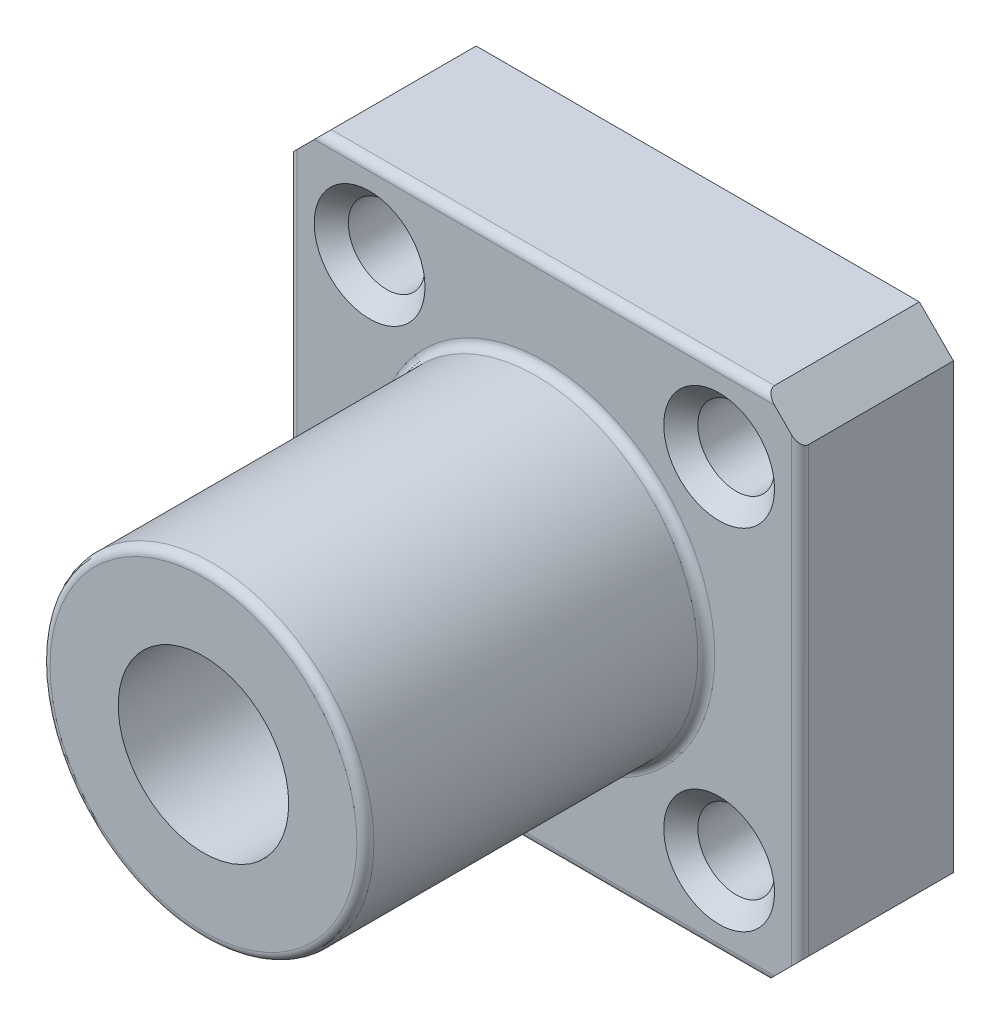
ISO-10303-21;
HEADER;
FILE_DESCRIPTION(('STEP AP214'),'2;1');
FILE_NAME('part.step','',(''),(''),'','','');
FILE_SCHEMA(('AUTOMOTIVE_DESIGN { 1 0 10303 214 1 1 1 1 }'));
ENDSEC;
DATA;
#1=APPLICATION_CONTEXT('core data for automotive mechanical design processes');
#2=APPLICATION_PROTOCOL_DEFINITION('international standard','automotive_design',2000,#1);
#3=PRODUCT_CONTEXT('',#1,'mechanical');
#4=PRODUCT('Part','Part','',(#3));
#5=PRODUCT_RELATED_PRODUCT_CATEGORY('part','',(#4));
#6=PRODUCT_DEFINITION_FORMATION('','',#4);
#7=PRODUCT_DEFINITION_CONTEXT('part definition',#1,'design');
#8=PRODUCT_DEFINITION('design','',#6,#7);
#9=PRODUCT_DEFINITION_SHAPE('','',#8);
#10=(LENGTH_UNIT() NAMED_UNIT(*) SI_UNIT(.MILLI.,.METRE.));
#11=(NAMED_UNIT(*) PLANE_ANGLE_UNIT() SI_UNIT($,.RADIAN.));
#12=(NAMED_UNIT(*) SI_UNIT($,.STERADIAN.) SOLID_ANGLE_UNIT());
#13=UNCERTAINTY_MEASURE_WITH_UNIT(LENGTH_MEASURE(1.E-05),#10,'distance_accuracy_value','');
#14=(GEOMETRIC_REPRESENTATION_CONTEXT(3) GLOBAL_UNCERTAINTY_ASSIGNED_CONTEXT((#13)) GLOBAL_UNIT_ASSIGNED_CONTEXT((#10,
#11,#12)) REPRESENTATION_CONTEXT('',''));
#15=CARTESIAN_POINT('',(0.,0.,0.));
#16=DIRECTION('',(0.,0.,1.));
#17=DIRECTION('',(1.,0.,0.));
#18=AXIS2_PLACEMENT_3D('',#15,#16,#17);
#19=CARTESIAN_POINT('',(0.,0.,9.));
#20=DIRECTION('',(0.,0.,1.));
#21=DIRECTION('',(1.,0.,0.));
#22=AXIS2_PLACEMENT_3D('',#19,#20,#21);
#23=PLANE('',#22);
#24=CARTESIAN_POINT('',(0.,0.,9.));
#25=DIRECTION('',(0.,0.,1.));
#26=DIRECTION('',(1.,0.,0.));
#27=AXIS2_PLACEMENT_3D('',#24,#25,#26);
#28=CIRCLE('',#27,10.);
#29=CARTESIAN_POINT('',(10.,0.,9.));
#30=VERTEX_POINT('',#29);
#31=EDGE_CURVE('E205',#30,#30,#28,.F.);
#32=ORIENTED_EDGE('',*,*,#31,.T.);
#33=EDGE_LOOP('',(#32));
#34=FACE_BOUND('',#33,.T.);
#35=DIRECTION('',(1.,0.,0.));
#36=VECTOR('',#35,1.);
#37=CARTESIAN_POINT('',(15.,-14.5,9.));
#38=LINE('',#37,#36);
#39=CARTESIAN_POINT('',(-13.5,-14.5,9.));
#40=VERTEX_POINT('',#39);
#41=CARTESIAN_POINT('',(13.5,-14.5,9.));
#42=VERTEX_POINT('',#41);
#43=EDGE_CURVE('E195',#40,#42,#38,.T.);
#44=ORIENTED_EDGE('',*,*,#43,.T.);
#45=DIRECTION('',(-0.707106781186548,-0.707106781186547,0.));
#46=VECTOR('',#45,1.);
#47=CARTESIAN_POINT('',(14.,-14.,9.));
#48=LINE('',#47,#46);
#49=CARTESIAN_POINT('',(14.5,-13.5,9.));
#50=VERTEX_POINT('',#49);
#51=EDGE_CURVE('E151',#42,#50,#48,.F.);
#52=ORIENTED_EDGE('',*,*,#51,.T.);
#53=DIRECTION('',(0.,1.,0.));
#54=VECTOR('',#53,1.);
#55=CARTESIAN_POINT('',(14.5,15.,9.));
#56=LINE('',#55,#54);
#57=CARTESIAN_POINT('',(14.5,13.5,9.));
#58=VERTEX_POINT('',#57);
#59=EDGE_CURVE('E206',#50,#58,#56,.T.);
#60=ORIENTED_EDGE('',*,*,#59,.T.);
#61=DIRECTION('',(0.707106781186546,-0.707106781186549,0.));
#62=VECTOR('',#61,1.);
#63=CARTESIAN_POINT('',(14.,14.,9.));
#64=LINE('',#63,#62);
#65=CARTESIAN_POINT('',(13.5,14.5,9.));
#66=VERTEX_POINT('',#65);
#67=EDGE_CURVE('E150',#58,#66,#64,.F.);
#68=ORIENTED_EDGE('',*,*,#67,.T.);
#69=DIRECTION('',(-1.,0.,0.));
#70=VECTOR('',#69,1.);
#71=CARTESIAN_POINT('',(-15.,14.5,9.));
#72=LINE('',#71,#70);
#73=CARTESIAN_POINT('',(-13.5,14.5,9.));
#74=VERTEX_POINT('',#73);
#75=EDGE_CURVE('E173',#66,#74,#72,.T.);
#76=ORIENTED_EDGE('',*,*,#75,.T.);
#77=DIRECTION('',(0.707106781186549,0.707106781186546,0.));
#78=VECTOR('',#77,1.);
#79=CARTESIAN_POINT('',(-14.,14.,9.));
#80=LINE('',#79,#78);
#81=CARTESIAN_POINT('',(-14.5,13.5,9.));
#82=VERTEX_POINT('',#81);
#83=EDGE_CURVE('E180',#74,#82,#80,.F.);
#84=ORIENTED_EDGE('',*,*,#83,.T.);
#85=DIRECTION('',(0.,-1.,0.));
#86=VECTOR('',#85,1.);
#87=CARTESIAN_POINT('',(-14.5,-15.,9.));
#88=LINE('',#87,#86);
#89=CARTESIAN_POINT('',(-14.5,-13.5,9.));
#90=VERTEX_POINT('',#89);
#91=EDGE_CURVE('E182',#82,#90,#88,.T.);
#92=ORIENTED_EDGE('',*,*,#91,.T.);
#93=DIRECTION('',(-0.707106781186546,0.707106781186549,0.));
#94=VECTOR('',#93,1.);
#95=CARTESIAN_POINT('',(-14.,-14.,9.));
#96=LINE('',#95,#94);
#97=EDGE_CURVE('E155',#90,#40,#96,.F.);
#98=ORIENTED_EDGE('',*,*,#97,.T.);
#99=EDGE_LOOP('',(#44,#52,#60,#68,#76,#84,#92,#98));
#100=FACE_BOUND('',#99,.T.);
#101=CARTESIAN_POINT('',(-10.2530483272048,10.253048327205,9.));
#102=DIRECTION('',(0.,0.,1.));
#103=DIRECTION('',(1.,0.,0.));
#104=AXIS2_PLACEMENT_3D('',#101,#102,#103);
#105=CIRCLE('',#104,3.24999999999999);
#106=CARTESIAN_POINT('',(-7.00304832720484,10.253048327205,9.));
#107=VERTEX_POINT('',#106);
#108=EDGE_CURVE('E241',#107,#107,#105,.F.);
#109=ORIENTED_EDGE('',*,*,#108,.T.);
#110=EDGE_LOOP('',(#109));
#111=FACE_BOUND('',#110,.T.);
#112=CARTESIAN_POINT('',(-10.2530483272049,-10.2530483272049,9.));
#113=DIRECTION('',(0.,0.,1.));
#114=DIRECTION('',(1.,0.,0.));
#115=AXIS2_PLACEMENT_3D('',#112,#113,#114);
#116=CIRCLE('',#115,3.25);
#117=CARTESIAN_POINT('',(-7.00304832720494,-10.2530483272049,9.));
#118=VERTEX_POINT('',#117);
#119=EDGE_CURVE('E247',#118,#118,#116,.F.);
#120=ORIENTED_EDGE('',*,*,#119,.T.);
#121=EDGE_LOOP('',(#120));
#122=FACE_BOUND('',#121,.T.);
#123=CARTESIAN_POINT('',(10.2530483272049,-10.253048327205,9.));
#124=DIRECTION('',(0.,0.,1.));
#125=DIRECTION('',(1.,0.,0.));
#126=AXIS2_PLACEMENT_3D('',#123,#124,#125);
#127=CIRCLE('',#126,3.24999999999999);
#128=CARTESIAN_POINT('',(13.5030483272049,-10.253048327205,9.));
#129=VERTEX_POINT('',#128);
#130=EDGE_CURVE('E253',#129,#129,#127,.F.);
#131=ORIENTED_EDGE('',*,*,#130,.T.);
#132=EDGE_LOOP('',(#131));
#133=FACE_BOUND('',#132,.T.);
#134=CARTESIAN_POINT('',(10.2530483272049,10.2530483272049,9.));
#135=DIRECTION('',(0.,0.,1.));
#136=DIRECTION('',(1.,0.,0.));
#137=AXIS2_PLACEMENT_3D('',#134,#135,#136);
#138=CIRCLE('',#137,3.25);
#139=CARTESIAN_POINT('',(13.5030483272049,10.2530483272049,9.));
#140=VERTEX_POINT('',#139);
#141=EDGE_CURVE('E259',#140,#140,#138,.F.);
#142=ORIENTED_EDGE('',*,*,#141,.T.);
#143=EDGE_LOOP('',(#142));
#144=FACE_BOUND('',#143,.T.);
#145=ADVANCED_FACE('F35',(#34,#100,#111,#122,#133,#144),#23,.T.);
#146=CARTESIAN_POINT('',(15.,15.,9.));
#147=DIRECTION('',(-1.,0.,0.));
#148=DIRECTION('',(0.,-1.,0.));
#149=AXIS2_PLACEMENT_3D('',#146,#147,#148);
#150=PLANE('',#149);
#151=DIRECTION('',(0.,1.,0.));
#152=VECTOR('',#151,1.);
#153=CARTESIAN_POINT('',(15.,-15.,8.5));
#154=LINE('',#153,#152);
#155=CARTESIAN_POINT('',(15.,13.,8.5));
#156=VERTEX_POINT('',#155);
#157=CARTESIAN_POINT('',(15.,-13.,8.5));
#158=VERTEX_POINT('',#157);
#159=EDGE_CURVE('E129',#156,#158,#154,.F.);
#160=ORIENTED_EDGE('',*,*,#159,.T.);
#161=DIRECTION('',(0.,0.,-1.));
#162=VECTOR('',#161,1.);
#163=CARTESIAN_POINT('',(15.,-13.,9.));
#164=LINE('',#163,#162);
#165=CARTESIAN_POINT('',(15.,-13.,0.));
#166=VERTEX_POINT('',#165);
#167=EDGE_CURVE('E135',#158,#166,#164,.T.);
#168=ORIENTED_EDGE('',*,*,#167,.T.);
#169=DIRECTION('',(0.,1.,0.));
#170=VECTOR('',#169,1.);
#171=CARTESIAN_POINT('',(15.,15.,0.));
#172=LINE('',#171,#170);
#173=CARTESIAN_POINT('',(15.,13.,0.));
#174=VERTEX_POINT('',#173);
#175=EDGE_CURVE('E132',#166,#174,#172,.T.);
#176=ORIENTED_EDGE('',*,*,#175,.T.);
#177=DIRECTION('',(0.,0.,1.));
#178=VECTOR('',#177,1.);
#179=CARTESIAN_POINT('',(15.,13.,9.));
#180=LINE('',#179,#178);
#181=EDGE_CURVE('E125',#174,#156,#180,.T.);
#182=ORIENTED_EDGE('',*,*,#181,.T.);
#183=EDGE_LOOP('',(#160,#168,#176,#182));
#184=FACE_BOUND('',#183,.T.);
#185=ADVANCED_FACE('F127',(#184),#150,.F.);
#186=CARTESIAN_POINT('',(-15.,15.,9.));
#187=DIRECTION('',(0.,-1.,0.));
#188=DIRECTION('',(0.,0.,-1.));
#189=AXIS2_PLACEMENT_3D('',#186,#187,#188);
#190=PLANE('',#189);
#191=DIRECTION('',(-1.,0.,0.));
#192=VECTOR('',#191,1.);
#193=CARTESIAN_POINT('',(15.,15.,8.5));
#194=LINE('',#193,#192);
#195=CARTESIAN_POINT('',(-13.,15.,8.5));
#196=VERTEX_POINT('',#195);
#197=CARTESIAN_POINT('',(13.,15.,8.5));
#198=VERTEX_POINT('',#197);
#199=EDGE_CURVE('E136',#196,#198,#194,.F.);
#200=ORIENTED_EDGE('',*,*,#199,.T.);
#201=DIRECTION('',(0.,0.,-1.));
#202=VECTOR('',#201,1.);
#203=CARTESIAN_POINT('',(13.,15.,9.));
#204=LINE('',#203,#202);
#205=CARTESIAN_POINT('',(13.,15.,0.));
#206=VERTEX_POINT('',#205);
#207=EDGE_CURVE('E168',#198,#206,#204,.T.);
#208=ORIENTED_EDGE('',*,*,#207,.T.);
#209=DIRECTION('',(-1.,0.,0.));
#210=VECTOR('',#209,1.);
#211=CARTESIAN_POINT('',(-15.,15.,0.));
#212=LINE('',#211,#210);
#213=CARTESIAN_POINT('',(-13.,15.,0.));
#214=VERTEX_POINT('',#213);
#215=EDGE_CURVE('E271',#206,#214,#212,.T.);
#216=ORIENTED_EDGE('',*,*,#215,.T.);
#217=DIRECTION('',(0.,0.,1.));
#218=VECTOR('',#217,1.);
#219=CARTESIAN_POINT('',(-13.,15.,9.));
#220=LINE('',#219,#218);
#221=EDGE_CURVE('E55',#214,#196,#220,.T.);
#222=ORIENTED_EDGE('',*,*,#221,.T.);
#223=EDGE_LOOP('',(#200,#208,#216,#222));
#224=FACE_BOUND('',#223,.T.);
#225=ADVANCED_FACE('F312',(#224),#190,.F.);
#226=CARTESIAN_POINT('',(-15.,15.,9.));
#227=DIRECTION('',(1.,0.,0.));
#228=DIRECTION('',(0.,1.,0.));
#229=AXIS2_PLACEMENT_3D('',#226,#227,#228);
#230=PLANE('',#229);
#231=DIRECTION('',(0.,-1.,0.));
#232=VECTOR('',#231,1.);
#233=CARTESIAN_POINT('',(-15.,15.,0.));
#234=LINE('',#233,#232);
#235=CARTESIAN_POINT('',(-15.,13.,0.));
#236=VERTEX_POINT('',#235);
#237=CARTESIAN_POINT('',(-15.,-13.,0.));
#238=VERTEX_POINT('',#237);
#239=EDGE_CURVE('E268',#236,#238,#234,.T.);
#240=ORIENTED_EDGE('',*,*,#239,.T.);
#241=DIRECTION('',(0.,0.,1.));
#242=VECTOR('',#241,1.);
#243=CARTESIAN_POINT('',(-15.,-13.,9.));
#244=LINE('',#243,#242);
#245=CARTESIAN_POINT('',(-15.,-13.,8.5));
#246=VERTEX_POINT('',#245);
#247=EDGE_CURVE('E161',#238,#246,#244,.T.);
#248=ORIENTED_EDGE('',*,*,#247,.T.);
#249=DIRECTION('',(0.,-1.,0.));
#250=VECTOR('',#249,1.);
#251=CARTESIAN_POINT('',(-15.,15.,8.5));
#252=LINE('',#251,#250);
#253=CARTESIAN_POINT('',(-15.,13.,8.5));
#254=VERTEX_POINT('',#253);
#255=EDGE_CURVE('E145',#246,#254,#252,.F.);
#256=ORIENTED_EDGE('',*,*,#255,.T.);
#257=DIRECTION('',(0.,0.,-1.));
#258=VECTOR('',#257,1.);
#259=CARTESIAN_POINT('',(-15.,13.,9.));
#260=LINE('',#259,#258);
#261=EDGE_CURVE('E153',#254,#236,#260,.T.);
#262=ORIENTED_EDGE('',*,*,#261,.T.);
#263=EDGE_LOOP('',(#240,#248,#256,#262));
#264=FACE_BOUND('',#263,.T.);
#265=ADVANCED_FACE('F315',(#264),#230,.F.);
#266=CARTESIAN_POINT('',(-15.,-15.,9.));
#267=DIRECTION('',(0.,1.,0.));
#268=DIRECTION('',(0.,0.,1.));
#269=AXIS2_PLACEMENT_3D('',#266,#267,#268);
#270=PLANE('',#269);
#271=DIRECTION('',(1.,0.,0.));
#272=VECTOR('',#271,1.);
#273=CARTESIAN_POINT('',(-15.,-15.,0.));
#274=LINE('',#273,#272);
#275=CARTESIAN_POINT('',(-13.,-15.,0.));
#276=VERTEX_POINT('',#275);
#277=CARTESIAN_POINT('',(13.,-15.,0.));
#278=VERTEX_POINT('',#277);
#279=EDGE_CURVE('E265',#276,#278,#274,.T.);
#280=ORIENTED_EDGE('',*,*,#279,.T.);
#281=DIRECTION('',(0.,0.,1.));
#282=VECTOR('',#281,1.);
#283=CARTESIAN_POINT('',(13.,-15.,9.));
#284=LINE('',#283,#282);
#285=CARTESIAN_POINT('',(13.,-15.,8.5));
#286=VERTEX_POINT('',#285);
#287=EDGE_CURVE('E212',#278,#286,#284,.T.);
#288=ORIENTED_EDGE('',*,*,#287,.T.);
#289=DIRECTION('',(1.,0.,0.));
#290=VECTOR('',#289,1.);
#291=CARTESIAN_POINT('',(-15.,-15.,8.5));
#292=LINE('',#291,#290);
#293=CARTESIAN_POINT('',(-13.,-15.,8.5));
#294=VERTEX_POINT('',#293);
#295=EDGE_CURVE('E146',#286,#294,#292,.F.);
#296=ORIENTED_EDGE('',*,*,#295,.T.);
#297=DIRECTION('',(0.,0.,-1.));
#298=VECTOR('',#297,1.);
#299=CARTESIAN_POINT('',(-13.,-15.,9.));
#300=LINE('',#299,#298);
#301=EDGE_CURVE('E211',#294,#276,#300,.T.);
#302=ORIENTED_EDGE('',*,*,#301,.T.);
#303=EDGE_LOOP('',(#280,#288,#296,#302));
#304=FACE_BOUND('',#303,.T.);
#305=ADVANCED_FACE('F299',(#304),#270,.F.);
#306=CARTESIAN_POINT('',(0.,0.,0.));
#307=DIRECTION('',(0.,0.,1.));
#308=DIRECTION('',(1.,0.,0.));
#309=AXIS2_PLACEMENT_3D('',#306,#307,#308);
#310=PLANE('',#309);
#311=CARTESIAN_POINT('',(-10.2530483272048,10.253048327205,0.));
#312=DIRECTION('',(0.,0.,-1.));
#313=DIRECTION('',(0.,-1.,0.));
#314=AXIS2_PLACEMENT_3D('',#311,#312,#313);
#315=CIRCLE('',#314,2.25);
#316=CARTESIAN_POINT('',(-10.2530483272049,8.00304832720505,0.));
#317=VERTEX_POINT('',#316);
#318=EDGE_CURVE('E289',#317,#317,#315,.T.);
#319=ORIENTED_EDGE('',*,*,#318,.F.);
#320=EDGE_LOOP('',(#319));
#321=FACE_BOUND('',#320,.T.);
#322=CARTESIAN_POINT('',(-10.2530483272049,-10.2530483272049,0.));
#323=DIRECTION('',(0.,0.,-1.));
#324=DIRECTION('',(1.,0.,0.));
#325=AXIS2_PLACEMENT_3D('',#322,#323,#324);
#326=CIRCLE('',#325,2.25);
#327=CARTESIAN_POINT('',(-8.00304832720494,-10.2530483272049,0.));
#328=VERTEX_POINT('',#327);
#329=EDGE_CURVE('E286',#328,#328,#326,.T.);
#330=ORIENTED_EDGE('',*,*,#329,.F.);
#331=EDGE_LOOP('',(#330));
#332=FACE_BOUND('',#331,.T.);
#333=CARTESIAN_POINT('',(10.2530483272049,-10.253048327205,0.));
#334=DIRECTION('',(0.,0.,-1.));
#335=DIRECTION('',(0.,1.,0.));
#336=AXIS2_PLACEMENT_3D('',#333,#334,#335);
#337=CIRCLE('',#336,2.25);
#338=CARTESIAN_POINT('',(10.2530483272049,-8.00304832720498,0.));
#339=VERTEX_POINT('',#338);
#340=EDGE_CURVE('E283',#339,#339,#337,.T.);
#341=ORIENTED_EDGE('',*,*,#340,.F.);
#342=EDGE_LOOP('',(#341));
#343=FACE_BOUND('',#342,.T.);
#344=CARTESIAN_POINT('',(10.2530483272049,10.2530483272049,0.));
#345=DIRECTION('',(0.,0.,-1.));
#346=DIRECTION('',(-1.,0.,0.));
#347=AXIS2_PLACEMENT_3D('',#344,#345,#346);
#348=CIRCLE('',#347,2.25);
#349=CARTESIAN_POINT('',(8.00304832720494,10.2530483272049,0.));
#350=VERTEX_POINT('',#349);
#351=EDGE_CURVE('E278',#350,#350,#348,.T.);
#352=ORIENTED_EDGE('',*,*,#351,.F.);
#353=EDGE_LOOP('',(#352));
#354=FACE_BOUND('',#353,.T.);
#355=CARTESIAN_POINT('',(0.,0.,0.));
#356=DIRECTION('',(0.,0.,1.));
#357=DIRECTION('',(1.,0.,0.));
#358=AXIS2_PLACEMENT_3D('',#355,#356,#357);
#359=CIRCLE('',#358,5.);
#360=CARTESIAN_POINT('',(5.,0.,0.));
#361=VERTEX_POINT('',#360);
#362=EDGE_CURVE('E274',#361,#361,#359,.T.);
#363=ORIENTED_EDGE('',*,*,#362,.T.);
#364=EDGE_LOOP('',(#363));
#365=FACE_BOUND('',#364,.T.);
#366=ORIENTED_EDGE('',*,*,#175,.F.);
#367=DIRECTION('',(0.707106781186548,0.707106781186547,0.));
#368=VECTOR('',#367,1.);
#369=CARTESIAN_POINT('',(15.,-13.,0.));
#370=LINE('',#369,#368);
#371=EDGE_CURVE('E216',#166,#278,#370,.F.);
#372=ORIENTED_EDGE('',*,*,#371,.T.);
#373=ORIENTED_EDGE('',*,*,#279,.F.);
#374=DIRECTION('',(0.707106781186546,-0.707106781186549,0.));
#375=VECTOR('',#374,1.);
#376=CARTESIAN_POINT('',(-13.,-15.,0.));
#377=LINE('',#376,#375);
#378=EDGE_CURVE('E218',#276,#238,#377,.F.);
#379=ORIENTED_EDGE('',*,*,#378,.T.);
#380=ORIENTED_EDGE('',*,*,#239,.F.);
#381=DIRECTION('',(-0.707106781186549,-0.707106781186546,0.));
#382=VECTOR('',#381,1.);
#383=CARTESIAN_POINT('',(-15.,13.,0.));
#384=LINE('',#383,#382);
#385=EDGE_CURVE('E222',#236,#214,#384,.F.);
#386=ORIENTED_EDGE('',*,*,#385,.T.);
#387=ORIENTED_EDGE('',*,*,#215,.F.);
#388=DIRECTION('',(-0.707106781186546,0.707106781186549,0.));
#389=VECTOR('',#388,1.);
#390=CARTESIAN_POINT('',(13.,15.,0.));
#391=LINE('',#390,#389);
#392=EDGE_CURVE('E220',#206,#174,#391,.F.);
#393=ORIENTED_EDGE('',*,*,#392,.T.);
#394=EDGE_LOOP('',(#366,#372,#373,#379,#380,#386,#387,#393));
#395=FACE_BOUND('',#394,.T.);
#396=ADVANCED_FACE('F295',(#321,#332,#343,#354,#365,#395),#310,.F.);
#397=CARTESIAN_POINT('',(0.,0.,29.));
#398=DIRECTION('',(0.,0.,-1.));
#399=DIRECTION('',(-1.,0.,0.));
#400=AXIS2_PLACEMENT_3D('',#397,#398,#399);
#401=CYLINDRICAL_SURFACE('',#400,9.5);
#402=CARTESIAN_POINT('',(0.,0.,9.5));
#403=DIRECTION('',(0.,0.,1.));
#404=DIRECTION('',(1.,0.,0.));
#405=AXIS2_PLACEMENT_3D('',#402,#403,#404);
#406=CIRCLE('',#405,9.5);
#407=CARTESIAN_POINT('',(9.5,0.,9.5));
#408=VERTEX_POINT('',#407);
#409=EDGE_CURVE('E183',#408,#408,#406,.T.);
#410=ORIENTED_EDGE('',*,*,#409,.T.);
#411=EDGE_LOOP('',(#410));
#412=FACE_BOUND('',#411,.T.);
#413=CARTESIAN_POINT('',(0.,0.,28.5));
#414=DIRECTION('',(0.,0.,1.));
#415=DIRECTION('',(1.,0.,0.));
#416=AXIS2_PLACEMENT_3D('',#413,#414,#415);
#417=CIRCLE('',#416,9.5);
#418=CARTESIAN_POINT('',(9.5,0.,28.5));
#419=VERTEX_POINT('',#418);
#420=EDGE_CURVE('E238',#419,#419,#417,.F.);
#421=ORIENTED_EDGE('',*,*,#420,.T.);
#422=EDGE_LOOP('',(#421));
#423=FACE_BOUND('',#422,.T.);
#424=ADVANCED_FACE('F298',(#412,#423),#401,.T.);
#425=CARTESIAN_POINT('',(0.,0.,29.));
#426=DIRECTION('',(0.,0.,1.));
#427=DIRECTION('',(1.,0.,0.));
#428=AXIS2_PLACEMENT_3D('',#425,#426,#427);
#429=PLANE('',#428);
#430=CARTESIAN_POINT('',(0.,0.,29.));
#431=DIRECTION('',(0.,0.,1.));
#432=DIRECTION('',(1.,0.,0.));
#433=AXIS2_PLACEMENT_3D('',#430,#431,#432);
#434=CIRCLE('',#433,9.);
#435=CARTESIAN_POINT('',(9.,0.,29.));
#436=VERTEX_POINT('',#435);
#437=EDGE_CURVE('E229',#436,#436,#434,.T.);
#438=ORIENTED_EDGE('',*,*,#437,.T.);
#439=EDGE_LOOP('',(#438));
#440=FACE_BOUND('',#439,.T.);
#441=CARTESIAN_POINT('',(0.,0.,29.));
#442=DIRECTION('',(0.,0.,1.));
#443=DIRECTION('',(1.,0.,0.));
#444=AXIS2_PLACEMENT_3D('',#441,#442,#443);
#445=CIRCLE('',#444,5.);
#446=CARTESIAN_POINT('',(5.,0.,29.));
#447=VERTEX_POINT('',#446);
#448=EDGE_CURVE('E275',#447,#447,#445,.T.);
#449=ORIENTED_EDGE('',*,*,#448,.F.);
#450=EDGE_LOOP('',(#449));
#451=FACE_BOUND('',#450,.T.);
#452=ADVANCED_FACE('F501',(#440,#451),#429,.T.);
#453=CARTESIAN_POINT('',(0.,0.,0.));
#454=DIRECTION('',(0.,0.,1.));
#455=DIRECTION('',(1.,0.,0.));
#456=AXIS2_PLACEMENT_3D('',#453,#454,#455);
#457=CYLINDRICAL_SURFACE('',#456,5.);
#458=ORIENTED_EDGE('',*,*,#362,.F.);
#459=EDGE_LOOP('',(#458));
#460=FACE_BOUND('',#459,.T.);
#461=ORIENTED_EDGE('',*,*,#448,.T.);
#462=EDGE_LOOP('',(#461));
#463=FACE_BOUND('',#462,.T.);
#464=ADVANCED_FACE('F492',(#460,#463),#457,.F.);
#465=CARTESIAN_POINT('',(10.2530483272049,10.2530483272049,29.));
#466=DIRECTION('',(0.,0.,-1.));
#467=DIRECTION('',(-1.,0.,0.));
#468=AXIS2_PLACEMENT_3D('',#465,#466,#467);
#469=CYLINDRICAL_SURFACE('',#468,2.25);
#470=CARTESIAN_POINT('',(10.2530483272049,10.2530483272049,8.));
#471=DIRECTION('',(0.,0.,1.));
#472=DIRECTION('',(1.,0.,0.));
#473=AXIS2_PLACEMENT_3D('',#470,#471,#472);
#474=CIRCLE('',#473,2.25);
#475=CARTESIAN_POINT('',(12.5030483272049,10.2530483272049,8.));
#476=VERTEX_POINT('',#475);
#477=EDGE_CURVE('E262',#476,#476,#474,.T.);
#478=ORIENTED_EDGE('',*,*,#477,.T.);
#479=EDGE_LOOP('',(#478));
#480=FACE_BOUND('',#479,.T.);
#481=ORIENTED_EDGE('',*,*,#351,.T.);
#482=EDGE_LOOP('',(#481));
#483=FACE_BOUND('',#482,.T.);
#484=ADVANCED_FACE('F351',(#480,#483),#469,.F.);
#485=CARTESIAN_POINT('',(10.2530483272049,10.2530483272049,8.));
#486=DIRECTION('',(0.,0.,1.));
#487=DIRECTION('',(1.,0.,0.));
#488=AXIS2_PLACEMENT_3D('',#485,#486,#487);
#489=CONICAL_SURFACE('',#488,2.25,0.785398163397451);
#490=ORIENTED_EDGE('',*,*,#141,.F.);
#491=EDGE_LOOP('',(#490));
#492=FACE_BOUND('',#491,.T.);
#493=ORIENTED_EDGE('',*,*,#477,.F.);
#494=EDGE_LOOP('',(#493));
#495=FACE_BOUND('',#494,.T.);
#496=ADVANCED_FACE('F347',(#492,#495),#489,.F.);
#497=CARTESIAN_POINT('',(10.2530483272049,-10.253048327205,29.));
#498=DIRECTION('',(0.,0.,-1.));
#499=DIRECTION('',(-1.,0.,0.));
#500=AXIS2_PLACEMENT_3D('',#497,#498,#499);
#501=CYLINDRICAL_SURFACE('',#500,2.25);
#502=CARTESIAN_POINT('',(10.2530483272049,-10.253048327205,8.00000000000001));
#503=DIRECTION('',(0.,0.,1.));
#504=DIRECTION('',(1.,0.,0.));
#505=AXIS2_PLACEMENT_3D('',#502,#503,#504);
#506=CIRCLE('',#505,2.25);
#507=CARTESIAN_POINT('',(12.5030483272049,-10.253048327205,8.00000000000001));
#508=VERTEX_POINT('',#507);
#509=EDGE_CURVE('E256',#508,#508,#506,.T.);
#510=ORIENTED_EDGE('',*,*,#509,.T.);
#511=EDGE_LOOP('',(#510));
#512=FACE_BOUND('',#511,.T.);
#513=ORIENTED_EDGE('',*,*,#340,.T.);
#514=EDGE_LOOP('',(#513));
#515=FACE_BOUND('',#514,.T.);
#516=ADVANCED_FACE('F350',(#512,#515),#501,.F.);
#517=CARTESIAN_POINT('',(-10.2530483272049,-10.2530483272049,29.));
#518=DIRECTION('',(0.,0.,-1.));
#519=DIRECTION('',(-1.,0.,0.));
#520=AXIS2_PLACEMENT_3D('',#517,#518,#519);
#521=CYLINDRICAL_SURFACE('',#520,2.25);
#522=CARTESIAN_POINT('',(-10.2530483272049,-10.2530483272049,8.));
#523=DIRECTION('',(0.,0.,1.));
#524=DIRECTION('',(1.,0.,0.));
#525=AXIS2_PLACEMENT_3D('',#522,#523,#524);
#526=CIRCLE('',#525,2.25);
#527=CARTESIAN_POINT('',(-8.00304832720494,-10.2530483272049,8.));
#528=VERTEX_POINT('',#527);
#529=EDGE_CURVE('E250',#528,#528,#526,.T.);
#530=ORIENTED_EDGE('',*,*,#529,.T.);
#531=EDGE_LOOP('',(#530));
#532=FACE_BOUND('',#531,.T.);
#533=ORIENTED_EDGE('',*,*,#329,.T.);
#534=EDGE_LOOP('',(#533));
#535=FACE_BOUND('',#534,.T.);
#536=ADVANCED_FACE('F462',(#532,#535),#521,.F.);
#537=CARTESIAN_POINT('',(-10.2530483272048,10.253048327205,29.));
#538=DIRECTION('',(0.,0.,-1.));
#539=DIRECTION('',(-1.,0.,0.));
#540=AXIS2_PLACEMENT_3D('',#537,#538,#539);
#541=CYLINDRICAL_SURFACE('',#540,2.25);
#542=CARTESIAN_POINT('',(-10.2530483272048,10.253048327205,8.00000000000001));
#543=DIRECTION('',(0.,0.,1.));
#544=DIRECTION('',(1.,0.,0.));
#545=AXIS2_PLACEMENT_3D('',#542,#543,#544);
#546=CIRCLE('',#545,2.25);
#547=CARTESIAN_POINT('',(-8.00304832720483,10.253048327205,8.00000000000001));
#548=VERTEX_POINT('',#547);
#549=EDGE_CURVE('E244',#548,#548,#546,.T.);
#550=ORIENTED_EDGE('',*,*,#549,.T.);
#551=EDGE_LOOP('',(#550));
#552=FACE_BOUND('',#551,.T.);
#553=ORIENTED_EDGE('',*,*,#318,.T.);
#554=EDGE_LOOP('',(#553));
#555=FACE_BOUND('',#554,.T.);
#556=ADVANCED_FACE('F293',(#552,#555),#541,.F.);
#557=CARTESIAN_POINT('',(10.2530483272049,-10.253048327205,8.00000000000001));
#558=DIRECTION('',(0.,0.,1.));
#559=DIRECTION('',(1.,0.,0.));
#560=AXIS2_PLACEMENT_3D('',#557,#558,#559);
#561=CONICAL_SURFACE('',#560,2.25,0.785398163397451);
#562=ORIENTED_EDGE('',*,*,#130,.F.);
#563=EDGE_LOOP('',(#562));
#564=FACE_BOUND('',#563,.T.);
#565=ORIENTED_EDGE('',*,*,#509,.F.);
#566=EDGE_LOOP('',(#565));
#567=FACE_BOUND('',#566,.T.);
#568=ADVANCED_FACE('F353',(#564,#567),#561,.F.);
#569=CARTESIAN_POINT('',(-10.2530483272049,-10.2530483272049,8.));
#570=DIRECTION('',(0.,0.,1.));
#571=DIRECTION('',(1.,0.,0.));
#572=AXIS2_PLACEMENT_3D('',#569,#570,#571);
#573=CONICAL_SURFACE('',#572,2.25,0.785398163397451);
#574=ORIENTED_EDGE('',*,*,#119,.F.);
#575=EDGE_LOOP('',(#574));
#576=FACE_BOUND('',#575,.T.);
#577=ORIENTED_EDGE('',*,*,#529,.F.);
#578=EDGE_LOOP('',(#577));
#579=FACE_BOUND('',#578,.T.);
#580=ADVANCED_FACE('F356',(#576,#579),#573,.F.);
#581=CARTESIAN_POINT('',(-10.2530483272048,10.253048327205,8.00000000000001));
#582=DIRECTION('',(0.,0.,1.));
#583=DIRECTION('',(1.,0.,0.));
#584=AXIS2_PLACEMENT_3D('',#581,#582,#583);
#585=CONICAL_SURFACE('',#584,2.25,0.785398163397451);
#586=ORIENTED_EDGE('',*,*,#108,.F.);
#587=EDGE_LOOP('',(#586));
#588=FACE_BOUND('',#587,.T.);
#589=ORIENTED_EDGE('',*,*,#549,.F.);
#590=EDGE_LOOP('',(#589));
#591=FACE_BOUND('',#590,.T.);
#592=ADVANCED_FACE('F360',(#588,#591),#585,.F.);
#593=CARTESIAN_POINT('',(0.,0.,9.5));
#594=DIRECTION('',(0.,0.,1.));
#595=DIRECTION('',(1.,0.,0.));
#596=AXIS2_PLACEMENT_3D('',#593,#594,#595);
#597=TOROIDAL_SURFACE('',#596,10.,0.5);
#598=ORIENTED_EDGE('',*,*,#31,.F.);
#599=EDGE_LOOP('',(#598));
#600=FACE_BOUND('',#599,.T.);
#601=ORIENTED_EDGE('',*,*,#409,.F.);
#602=EDGE_LOOP('',(#601));
#603=FACE_BOUND('',#602,.T.);
#604=ADVANCED_FACE('F364',(#600,#603),#597,.F.);
#605=CARTESIAN_POINT('',(0.,0.,28.5));
#606=DIRECTION('',(0.,0.,1.));
#607=DIRECTION('',(1.,0.,0.));
#608=AXIS2_PLACEMENT_3D('',#605,#606,#607);
#609=TOROIDAL_SURFACE('',#608,9.,0.5);
#610=ORIENTED_EDGE('',*,*,#420,.F.);
#611=EDGE_LOOP('',(#610));
#612=FACE_BOUND('',#611,.T.);
#613=ORIENTED_EDGE('',*,*,#437,.F.);
#614=EDGE_LOOP('',(#613));
#615=FACE_BOUND('',#614,.T.);
#616=ADVANCED_FACE('F368',(#612,#615),#609,.T.);
#617=CARTESIAN_POINT('',(0.,14.5,8.5));
#618=DIRECTION('',(1.,0.,0.));
#619=DIRECTION('',(0.,0.,-1.));
#620=AXIS2_PLACEMENT_3D('',#617,#618,#619);
#621=CYLINDRICAL_SURFACE('',#620,0.5);
#622=ORIENTED_EDGE('',*,*,#75,.F.);
#623=CARTESIAN_POINT('',(13.5,14.5,8.5));
#624=DIRECTION('',(-0.707106781186549,-0.707106781186546,0.));
#625=DIRECTION('',(0.707106781186546,-0.707106781186549,0.));
#626=AXIS2_PLACEMENT_3D('',#623,#624,#625);
#627=ELLIPSE('',#626,0.707106781186546,0.5);
#628=EDGE_CURVE('E11',#66,#198,#627,.T.);
#629=ORIENTED_EDGE('',*,*,#628,.T.);
#630=ORIENTED_EDGE('',*,*,#199,.F.);
#631=CARTESIAN_POINT('',(-13.5,14.5,8.5));
#632=DIRECTION('',(0.707106781186546,-0.707106781186549,0.));
#633=DIRECTION('',(0.707106781186549,0.707106781186546,0.));
#634=AXIS2_PLACEMENT_3D('',#631,#632,#633);
#635=ELLIPSE('',#634,0.707106781186549,0.5);
#636=EDGE_CURVE('E43',#196,#74,#635,.T.);
#637=ORIENTED_EDGE('',*,*,#636,.T.);
#638=EDGE_LOOP('',(#622,#629,#630,#637));
#639=FACE_BOUND('',#638,.T.);
#640=ADVANCED_FACE('F172',(#639),#621,.T.);
#641=CARTESIAN_POINT('',(-14.5,0.,8.5));
#642=DIRECTION('',(0.,1.,0.));
#643=DIRECTION('',(-1.,0.,0.));
#644=AXIS2_PLACEMENT_3D('',#641,#642,#643);
#645=CYLINDRICAL_SURFACE('',#644,0.5);
#646=ORIENTED_EDGE('',*,*,#255,.F.);
#647=CARTESIAN_POINT('',(-14.5,-13.5,8.5));
#648=DIRECTION('',(0.707106781186549,0.707106781186546,0.));
#649=DIRECTION('',(-0.707106781186546,0.707106781186549,0.));
#650=AXIS2_PLACEMENT_3D('',#647,#648,#649);
#651=ELLIPSE('',#650,0.707106781186549,0.5);
#652=EDGE_CURVE('E165',#246,#90,#651,.T.);
#653=ORIENTED_EDGE('',*,*,#652,.T.);
#654=ORIENTED_EDGE('',*,*,#91,.F.);
#655=CARTESIAN_POINT('',(-14.5,13.5,8.5));
#656=DIRECTION('',(0.707106781186546,-0.707106781186549,0.));
#657=DIRECTION('',(0.707106781186549,0.707106781186546,0.));
#658=AXIS2_PLACEMENT_3D('',#655,#656,#657);
#659=ELLIPSE('',#658,0.707106781186546,0.5);
#660=EDGE_CURVE('E163',#82,#254,#659,.T.);
#661=ORIENTED_EDGE('',*,*,#660,.T.);
#662=EDGE_LOOP('',(#646,#653,#654,#661));
#663=FACE_BOUND('',#662,.T.);
#664=ADVANCED_FACE('F375',(#663),#645,.T.);
#665=CARTESIAN_POINT('',(14.5,0.,8.5));
#666=DIRECTION('',(0.,-1.,0.));
#667=DIRECTION('',(1.,0.,0.));
#668=AXIS2_PLACEMENT_3D('',#665,#666,#667);
#669=CYLINDRICAL_SURFACE('',#668,0.5);
#670=ORIENTED_EDGE('',*,*,#59,.F.);
#671=CARTESIAN_POINT('',(14.5,-13.5,8.5));
#672=DIRECTION('',(-0.707106781186547,0.707106781186548,0.));
#673=DIRECTION('',(-0.707106781186548,-0.707106781186547,0.));
#674=AXIS2_PLACEMENT_3D('',#671,#672,#673);
#675=ELLIPSE('',#674,0.707106781186547,0.5);
#676=EDGE_CURVE('E144',#50,#158,#675,.T.);
#677=ORIENTED_EDGE('',*,*,#676,.T.);
#678=ORIENTED_EDGE('',*,*,#159,.F.);
#679=CARTESIAN_POINT('',(14.5,13.5,8.5));
#680=DIRECTION('',(-0.707106781186549,-0.707106781186546,0.));
#681=DIRECTION('',(0.707106781186546,-0.707106781186549,0.));
#682=AXIS2_PLACEMENT_3D('',#679,#680,#681);
#683=ELLIPSE('',#682,0.707106781186549,0.5);
#684=EDGE_CURVE('E141',#156,#58,#683,.T.);
#685=ORIENTED_EDGE('',*,*,#684,.T.);
#686=EDGE_LOOP('',(#670,#677,#678,#685));
#687=FACE_BOUND('',#686,.T.);
#688=ADVANCED_FACE('F140',(#687),#669,.T.);
#689=CARTESIAN_POINT('',(0.,-14.5,8.5));
#690=DIRECTION('',(-1.,0.,0.));
#691=DIRECTION('',(0.,0.,1.));
#692=AXIS2_PLACEMENT_3D('',#689,#690,#691);
#693=CYLINDRICAL_SURFACE('',#692,0.5);
#694=ORIENTED_EDGE('',*,*,#295,.F.);
#695=CARTESIAN_POINT('',(13.5,-14.5,8.5));
#696=DIRECTION('',(-0.707106781186547,0.707106781186548,0.));
#697=DIRECTION('',(-0.707106781186548,-0.707106781186547,0.));
#698=AXIS2_PLACEMENT_3D('',#695,#696,#697);
#699=ELLIPSE('',#698,0.707106781186548,0.5);
#700=EDGE_CURVE('E187',#286,#42,#699,.T.);
#701=ORIENTED_EDGE('',*,*,#700,.T.);
#702=ORIENTED_EDGE('',*,*,#43,.F.);
#703=CARTESIAN_POINT('',(-13.5,-14.5,8.5));
#704=DIRECTION('',(0.707106781186549,0.707106781186546,0.));
#705=DIRECTION('',(-0.707106781186546,0.707106781186549,0.));
#706=AXIS2_PLACEMENT_3D('',#703,#704,#705);
#707=ELLIPSE('',#706,0.707106781186546,0.5);
#708=EDGE_CURVE('E190',#40,#294,#707,.T.);
#709=ORIENTED_EDGE('',*,*,#708,.T.);
#710=EDGE_LOOP('',(#694,#701,#702,#709));
#711=FACE_BOUND('',#710,.T.);
#712=ADVANCED_FACE('F202',(#711),#693,.T.);
#713=CARTESIAN_POINT('',(15.,-13.,9.));
#714=DIRECTION('',(-0.707106781186547,0.707106781186548,0.));
#715=DIRECTION('',(0.,0.,-1.));
#716=AXIS2_PLACEMENT_3D('',#713,#714,#715);
#717=PLANE('',#716);
#718=ORIENTED_EDGE('',*,*,#700,.F.);
#719=ORIENTED_EDGE('',*,*,#287,.F.);
#720=ORIENTED_EDGE('',*,*,#371,.F.);
#721=ORIENTED_EDGE('',*,*,#167,.F.);
#722=ORIENTED_EDGE('',*,*,#676,.F.);
#723=ORIENTED_EDGE('',*,*,#51,.F.);
#724=EDGE_LOOP('',(#718,#719,#720,#721,#722,#723));
#725=FACE_BOUND('',#724,.T.);
#726=ADVANCED_FACE('F321',(#725),#717,.F.);
#727=CARTESIAN_POINT('',(-13.,-15.,9.));
#728=DIRECTION('',(0.707106781186549,0.707106781186546,0.));
#729=DIRECTION('',(0.,0.,-1.));
#730=AXIS2_PLACEMENT_3D('',#727,#728,#729);
#731=PLANE('',#730);
#732=ORIENTED_EDGE('',*,*,#652,.F.);
#733=ORIENTED_EDGE('',*,*,#247,.F.);
#734=ORIENTED_EDGE('',*,*,#378,.F.);
#735=ORIENTED_EDGE('',*,*,#301,.F.);
#736=ORIENTED_EDGE('',*,*,#708,.F.);
#737=ORIENTED_EDGE('',*,*,#97,.F.);
#738=EDGE_LOOP('',(#732,#733,#734,#735,#736,#737));
#739=FACE_BOUND('',#738,.T.);
#740=ADVANCED_FACE('F209',(#739),#731,.F.);
#741=CARTESIAN_POINT('',(13.,15.,9.));
#742=DIRECTION('',(-0.707106781186549,-0.707106781186546,0.));
#743=DIRECTION('',(0.,0.,-1.));
#744=AXIS2_PLACEMENT_3D('',#741,#742,#743);
#745=PLANE('',#744);
#746=ORIENTED_EDGE('',*,*,#684,.F.);
#747=ORIENTED_EDGE('',*,*,#181,.F.);
#748=ORIENTED_EDGE('',*,*,#392,.F.);
#749=ORIENTED_EDGE('',*,*,#207,.F.);
#750=ORIENTED_EDGE('',*,*,#628,.F.);
#751=ORIENTED_EDGE('',*,*,#67,.F.);
#752=EDGE_LOOP('',(#746,#747,#748,#749,#750,#751));
#753=FACE_BOUND('',#752,.T.);
#754=ADVANCED_FACE('F149',(#753),#745,.F.);
#755=CARTESIAN_POINT('',(-15.,13.,9.));
#756=DIRECTION('',(0.707106781186546,-0.707106781186549,0.));
#757=DIRECTION('',(0.,0.,-1.));
#758=AXIS2_PLACEMENT_3D('',#755,#756,#757);
#759=PLANE('',#758);
#760=ORIENTED_EDGE('',*,*,#636,.F.);
#761=ORIENTED_EDGE('',*,*,#221,.F.);
#762=ORIENTED_EDGE('',*,*,#385,.F.);
#763=ORIENTED_EDGE('',*,*,#261,.F.);
#764=ORIENTED_EDGE('',*,*,#660,.F.);
#765=ORIENTED_EDGE('',*,*,#83,.F.);
#766=EDGE_LOOP('',(#760,#761,#762,#763,#764,#765));
#767=FACE_BOUND('',#766,.T.);
#768=ADVANCED_FACE('F37',(#767),#759,.F.);
#769=CLOSED_SHELL('',(#145,#185,#225,#265,#305,#396,#424,#452,#464,#484,#496,#516,#536,#556,
#568,#580,#592,#604,#616,#640,#664,#688,#712,#726,#740,#754,#768));
#770=MANIFOLD_SOLID_BREP('B2',#769);
#771=ADVANCED_BREP_SHAPE_REPRESENTATION('',(#18,#770),#14);
#772=SHAPE_DEFINITION_REPRESENTATION(#9,#771);
ENDSEC;
END-ISO-10303-21;
